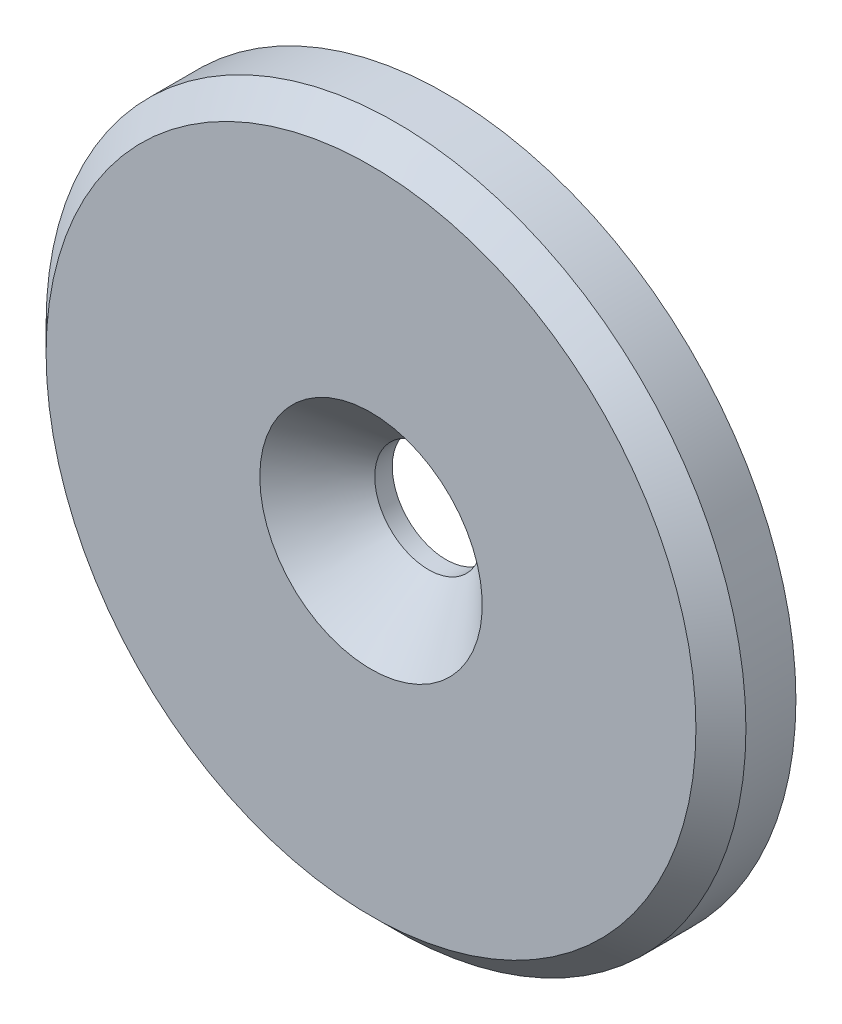
ISO-10303-21;
HEADER;
FILE_DESCRIPTION(('STEP AP214'),'2;1');
FILE_NAME('part.step','',(''),(''),'','','');
FILE_SCHEMA(('AUTOMOTIVE_DESIGN { 1 0 10303 214 1 1 1 1 }'));
ENDSEC;
DATA;
#1=APPLICATION_CONTEXT('core data for automotive mechanical design processes');
#2=APPLICATION_PROTOCOL_DEFINITION('international standard','automotive_design',2000,#1);
#3=PRODUCT_CONTEXT('',#1,'mechanical');
#4=PRODUCT('Part','Part','',(#3));
#5=PRODUCT_RELATED_PRODUCT_CATEGORY('part','',(#4));
#6=PRODUCT_DEFINITION_FORMATION('','',#4);
#7=PRODUCT_DEFINITION_CONTEXT('part definition',#1,'design');
#8=PRODUCT_DEFINITION('design','',#6,#7);
#9=PRODUCT_DEFINITION_SHAPE('','',#8);
#10=(LENGTH_UNIT() NAMED_UNIT(*) SI_UNIT(.MILLI.,.METRE.));
#11=(NAMED_UNIT(*) PLANE_ANGLE_UNIT() SI_UNIT($,.RADIAN.));
#12=(NAMED_UNIT(*) SI_UNIT($,.STERADIAN.) SOLID_ANGLE_UNIT());
#13=UNCERTAINTY_MEASURE_WITH_UNIT(LENGTH_MEASURE(1.E-05),#10,'distance_accuracy_value','');
#14=(GEOMETRIC_REPRESENTATION_CONTEXT(3) GLOBAL_UNCERTAINTY_ASSIGNED_CONTEXT((#13)) GLOBAL_UNIT_ASSIGNED_CONTEXT((#10,
#11,#12)) REPRESENTATION_CONTEXT('',''));
#15=CARTESIAN_POINT('',(0.,0.,0.));
#16=DIRECTION('',(0.,0.,1.));
#17=DIRECTION('',(1.,0.,0.));
#18=AXIS2_PLACEMENT_3D('',#15,#16,#17);
#19=CARTESIAN_POINT('',(0.,0.,0.));
#20=DIRECTION('',(0.,0.,1.));
#21=DIRECTION('',(1.,0.,0.));
#22=AXIS2_PLACEMENT_3D('',#19,#20,#21);
#23=PLANE('',#22);
#24=CARTESIAN_POINT('',(0.,0.,0.));
#25=DIRECTION('',(0.,0.,-1.));
#26=DIRECTION('',(-1.,0.,0.));
#27=AXIS2_PLACEMENT_3D('',#24,#25,#26);
#28=CIRCLE('',#27,14.);
#29=CARTESIAN_POINT('',(-14.,0.,0.));
#30=VERTEX_POINT('',#29);
#31=EDGE_CURVE('E51',#30,#30,#28,.T.);
#32=ORIENTED_EDGE('',*,*,#31,.T.);
#33=EDGE_LOOP('',(#32));
#34=FACE_BOUND('',#33,.T.);
#35=CARTESIAN_POINT('',(0.,0.,0.));
#36=DIRECTION('',(0.,0.,-1.));
#37=DIRECTION('',(-1.,0.,0.));
#38=AXIS2_PLACEMENT_3D('',#35,#36,#37);
#39=CIRCLE('',#38,2.15);
#40=CARTESIAN_POINT('',(-2.15,0.,0.));
#41=VERTEX_POINT('',#40);
#42=EDGE_CURVE('E109',#41,#41,#39,.T.);
#43=ORIENTED_EDGE('',*,*,#42,.F.);
#44=EDGE_LOOP('',(#43));
#45=FACE_BOUND('',#44,.T.);
#46=ADVANCED_FACE('F95',(#34,#45),#23,.F.);
#47=CARTESIAN_POINT('',(14.,0.,3.));
#48=DIRECTION('',(0.,0.,-1.));
#49=DIRECTION('',(-1.,0.,0.));
#50=AXIS2_PLACEMENT_3D('',#47,#48,#49);
#51=PLANE('',#50);
#52=CARTESIAN_POINT('',(0.,0.,3.));
#53=DIRECTION('',(0.,0.,-1.));
#54=DIRECTION('',(-1.,0.,0.));
#55=AXIS2_PLACEMENT_3D('',#52,#53,#54);
#56=CIRCLE('',#55,13.);
#57=CARTESIAN_POINT('',(-13.,0.,3.));
#58=VERTEX_POINT('',#57);
#59=EDGE_CURVE('E101',#58,#58,#56,.T.);
#60=ORIENTED_EDGE('',*,*,#59,.F.);
#61=EDGE_LOOP('',(#60));
#62=FACE_BOUND('',#61,.T.);
#63=CARTESIAN_POINT('',(0.,0.,3.));
#64=DIRECTION('',(0.,0.,-1.));
#65=DIRECTION('',(-1.,0.,0.));
#66=AXIS2_PLACEMENT_3D('',#63,#64,#65);
#67=CIRCLE('',#66,4.44999999999999);
#68=CARTESIAN_POINT('',(-4.44999999999997,0.,3.00000000000003));
#69=VERTEX_POINT('',#68);
#70=EDGE_CURVE('E117',#69,#69,#67,.T.);
#71=ORIENTED_EDGE('',*,*,#70,.T.);
#72=EDGE_LOOP('',(#71));
#73=FACE_BOUND('',#72,.T.);
#74=ADVANCED_FACE('F121',(#62,#73),#51,.F.);
#75=CARTESIAN_POINT('',(0.,0.,3.));
#76=DIRECTION('',(0.,0.,-1.));
#77=DIRECTION('',(-1.,0.,0.));
#78=AXIS2_PLACEMENT_3D('',#75,#76,#77);
#79=CYLINDRICAL_SURFACE('',#78,14.);
#80=ORIENTED_EDGE('',*,*,#31,.F.);
#81=EDGE_LOOP('',(#80));
#82=FACE_BOUND('',#81,.T.);
#83=CARTESIAN_POINT('',(0.,0.,2.));
#84=DIRECTION('',(0.,0.,-1.));
#85=DIRECTION('',(-1.,0.,0.));
#86=AXIS2_PLACEMENT_3D('',#83,#84,#85);
#87=CIRCLE('',#86,14.);
#88=CARTESIAN_POINT('',(-14.,0.,2.));
#89=VERTEX_POINT('',#88);
#90=EDGE_CURVE('E105',#89,#89,#87,.T.);
#91=ORIENTED_EDGE('',*,*,#90,.T.);
#92=EDGE_LOOP('',(#91));
#93=FACE_BOUND('',#92,.T.);
#94=ADVANCED_FACE('F138',(#82,#93),#79,.T.);
#95=CARTESIAN_POINT('',(0.,0.,2.));
#96=DIRECTION('',(0.,0.,-1.));
#97=DIRECTION('',(-1.,0.,0.));
#98=AXIS2_PLACEMENT_3D('',#95,#96,#97);
#99=CONICAL_SURFACE('',#98,14.,0.785398163397448);
#100=ORIENTED_EDGE('',*,*,#59,.T.);
#101=EDGE_LOOP('',(#100));
#102=FACE_BOUND('',#101,.T.);
#103=ORIENTED_EDGE('',*,*,#90,.F.);
#104=EDGE_LOOP('',(#103));
#105=FACE_BOUND('',#104,.T.);
#106=ADVANCED_FACE('F131',(#102,#105),#99,.T.);
#107=CARTESIAN_POINT('',(0.,0.,3.));
#108=DIRECTION('',(0.,0.,-1.));
#109=DIRECTION('',(-1.,0.,0.));
#110=AXIS2_PLACEMENT_3D('',#107,#108,#109);
#111=CYLINDRICAL_SURFACE('',#110,2.15);
#112=ORIENTED_EDGE('',*,*,#42,.T.);
#113=EDGE_LOOP('',(#112));
#114=FACE_BOUND('',#113,.T.);
#115=CARTESIAN_POINT('',(0.,0.,0.700000000000001));
#116=DIRECTION('',(0.,0.,-1.));
#117=DIRECTION('',(-1.,0.,0.));
#118=AXIS2_PLACEMENT_3D('',#115,#116,#117);
#119=CIRCLE('',#118,2.15);
#120=CARTESIAN_POINT('',(-2.14999999999999,0.,0.700000000000015));
#121=VERTEX_POINT('',#120);
#122=EDGE_CURVE('E114',#121,#121,#119,.T.);
#123=ORIENTED_EDGE('',*,*,#122,.F.);
#124=EDGE_LOOP('',(#123));
#125=FACE_BOUND('',#124,.T.);
#126=ADVANCED_FACE('F125',(#114,#125),#111,.F.);
#127=CARTESIAN_POINT('',(0.,0.,3.));
#128=DIRECTION('',(0.,0.,1.));
#129=DIRECTION('',(1.,0.,0.));
#130=AXIS2_PLACEMENT_3D('',#127,#128,#129);
#131=CONICAL_SURFACE('',#130,4.44999999999999,0.785398163397447);
#132=ORIENTED_EDGE('',*,*,#122,.T.);
#133=EDGE_LOOP('',(#132));
#134=FACE_BOUND('',#133,.T.);
#135=ORIENTED_EDGE('',*,*,#70,.F.);
#136=EDGE_LOOP('',(#135));
#137=FACE_BOUND('',#136,.T.);
#138=ADVANCED_FACE('F123',(#134,#137),#131,.F.);
#139=CLOSED_SHELL('',(#46,#74,#94,#106,#126,#138));
#140=MANIFOLD_SOLID_BREP('B6',#139);
#141=ADVANCED_BREP_SHAPE_REPRESENTATION('',(#18,#140),#14);
#142=SHAPE_DEFINITION_REPRESENTATION(#9,#141);
ENDSEC;
END-ISO-10303-21;
